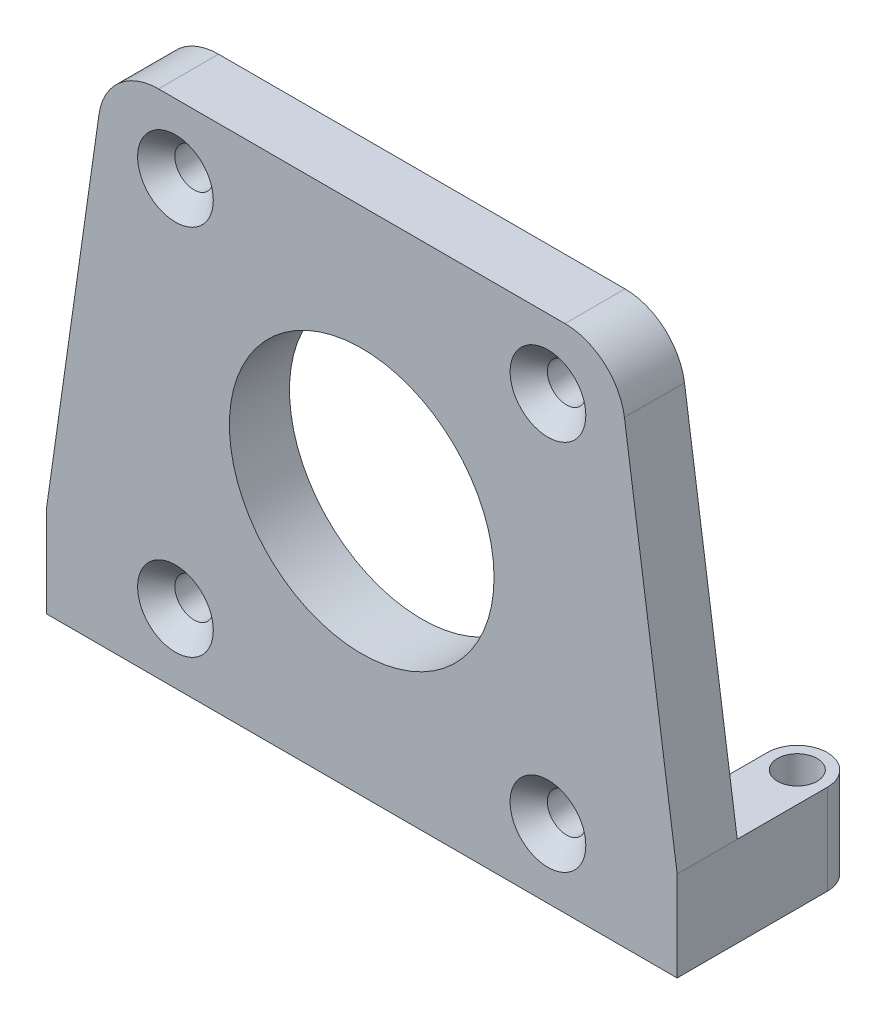
ISO-10303-21;
HEADER;
FILE_DESCRIPTION(('STEP AP214'),'2;1');
FILE_NAME('part.step','',(''),(''),'','','');
FILE_SCHEMA(('AUTOMOTIVE_DESIGN { 1 0 10303 214 1 1 1 1 }'));
ENDSEC;
DATA;
#1=APPLICATION_CONTEXT('core data for automotive mechanical design processes');
#2=APPLICATION_PROTOCOL_DEFINITION('international standard','automotive_design',2000,#1);
#3=PRODUCT_CONTEXT('',#1,'mechanical');
#4=PRODUCT('Part','Part','',(#3));
#5=PRODUCT_RELATED_PRODUCT_CATEGORY('part','',(#4));
#6=PRODUCT_DEFINITION_FORMATION('','',#4);
#7=PRODUCT_DEFINITION_CONTEXT('part definition',#1,'design');
#8=PRODUCT_DEFINITION('design','',#6,#7);
#9=PRODUCT_DEFINITION_SHAPE('','',#8);
#10=(LENGTH_UNIT() NAMED_UNIT(*) SI_UNIT(.MILLI.,.METRE.));
#11=(NAMED_UNIT(*) PLANE_ANGLE_UNIT() SI_UNIT($,.RADIAN.));
#12=(NAMED_UNIT(*) SI_UNIT($,.STERADIAN.) SOLID_ANGLE_UNIT());
#13=UNCERTAINTY_MEASURE_WITH_UNIT(LENGTH_MEASURE(1.E-05),#10,'distance_accuracy_value','');
#14=(GEOMETRIC_REPRESENTATION_CONTEXT(3) GLOBAL_UNCERTAINTY_ASSIGNED_CONTEXT((#13)) GLOBAL_UNIT_ASSIGNED_CONTEXT((#10,
#11,#12)) REPRESENTATION_CONTEXT('',''));
#15=CARTESIAN_POINT('',(0.,0.,0.));
#16=DIRECTION('',(0.,0.,1.));
#17=DIRECTION('',(1.,0.,0.));
#18=AXIS2_PLACEMENT_3D('',#15,#16,#17);
#19=CARTESIAN_POINT('',(9.33647700847534,37.5,0.));
#20=DIRECTION('',(0.,0.,-1.));
#21=DIRECTION('',(-1.,0.,0.));
#22=AXIS2_PLACEMENT_3D('',#19,#20,#21);
#23=PLANE('',#22);
#24=CARTESIAN_POINT('',(10.75,36.75,0.));
#25=DIRECTION('',(0.,0.,-1.));
#26=DIRECTION('',(-1.,0.,0.));
#27=AXIS2_PLACEMENT_3D('',#24,#25,#26);
#28=CIRCLE('',#27,1.6);
#29=CARTESIAN_POINT('',(9.15,36.75,0.));
#30=VERTEX_POINT('',#29);
#31=EDGE_CURVE('E43',#30,#30,#28,.T.);
#32=ORIENTED_EDGE('',*,*,#31,.F.);
#33=EDGE_LOOP('',(#32));
#34=FACE_BOUND('',#33,.T.);
#35=CARTESIAN_POINT('',(41.75,5.75,0.));
#36=DIRECTION('',(0.,0.,-1.));
#37=DIRECTION('',(-1.,0.,0.));
#38=AXIS2_PLACEMENT_3D('',#35,#36,#37);
#39=CIRCLE('',#38,1.6);
#40=CARTESIAN_POINT('',(40.15,5.75,0.));
#41=VERTEX_POINT('',#40);
#42=EDGE_CURVE('E175',#41,#41,#39,.T.);
#43=ORIENTED_EDGE('',*,*,#42,.F.);
#44=EDGE_LOOP('',(#43));
#45=FACE_BOUND('',#44,.T.);
#46=CARTESIAN_POINT('',(10.75,5.75,0.));
#47=DIRECTION('',(0.,0.,-1.));
#48=DIRECTION('',(-1.,0.,0.));
#49=AXIS2_PLACEMENT_3D('',#46,#47,#48);
#50=CIRCLE('',#49,1.6);
#51=CARTESIAN_POINT('',(9.15,5.75,0.));
#52=VERTEX_POINT('',#51);
#53=EDGE_CURVE('E182',#52,#52,#50,.T.);
#54=ORIENTED_EDGE('',*,*,#53,.F.);
#55=EDGE_LOOP('',(#54));
#56=FACE_BOUND('',#55,.T.);
#57=CARTESIAN_POINT('',(41.75,36.75,0.));
#58=DIRECTION('',(0.,0.,-1.));
#59=DIRECTION('',(-1.,0.,0.));
#60=AXIS2_PLACEMENT_3D('',#57,#58,#59);
#61=CIRCLE('',#60,1.6);
#62=CARTESIAN_POINT('',(40.15,36.75,0.));
#63=VERTEX_POINT('',#62);
#64=EDGE_CURVE('E189',#63,#63,#61,.T.);
#65=ORIENTED_EDGE('',*,*,#64,.F.);
#66=EDGE_LOOP('',(#65));
#67=FACE_BOUND('',#66,.T.);
#68=DIRECTION('',(0.,-1.,0.));
#69=VECTOR('',#68,1.);
#70=CARTESIAN_POINT('',(5.,7.5,0.));
#71=LINE('',#70,#69);
#72=CARTESIAN_POINT('',(5.,7.5,0.));
#73=VERTEX_POINT('',#72);
#74=CARTESIAN_POINT('',(5.,0.,0.));
#75=VERTEX_POINT('',#74);
#76=EDGE_CURVE('E205',#73,#75,#71,.T.);
#77=ORIENTED_EDGE('',*,*,#76,.F.);
#78=DIRECTION('',(-1.,0.,0.));
#79=VECTOR('',#78,1.);
#80=CARTESIAN_POINT('',(0.,7.5,0.));
#81=LINE('',#80,#79);
#82=CARTESIAN_POINT('',(0.,7.5,0.));
#83=VERTEX_POINT('',#82);
#84=EDGE_CURVE('E198',#73,#83,#81,.T.);
#85=ORIENTED_EDGE('',*,*,#84,.T.);
#86=DIRECTION('',(-0.141421356237309,-0.989949493661166,0.));
#87=VECTOR('',#86,1.);
#88=CARTESIAN_POINT('',(0.,7.5,0.));
#89=LINE('',#88,#87);
#90=CARTESIAN_POINT('',(4.38672954016951,38.2071067811865,0.));
#91=VERTEX_POINT('',#90);
#92=EDGE_CURVE('E260',#91,#83,#89,.T.);
#93=ORIENTED_EDGE('',*,*,#92,.F.);
#94=CARTESIAN_POINT('',(9.33647700847534,37.5,0.));
#95=DIRECTION('',(0.,0.,1.));
#96=DIRECTION('',(-1.,0.,0.));
#97=AXIS2_PLACEMENT_3D('',#94,#95,#96);
#98=CIRCLE('',#97,5.);
#99=CARTESIAN_POINT('',(9.33647700847537,42.5,0.));
#100=VERTEX_POINT('',#99);
#101=EDGE_CURVE('E258',#100,#91,#98,.T.);
#102=ORIENTED_EDGE('',*,*,#101,.F.);
#103=DIRECTION('',(-1.,0.,0.));
#104=VECTOR('',#103,1.);
#105=CARTESIAN_POINT('',(9.33647700847537,42.5,0.));
#106=LINE('',#105,#104);
#107=CARTESIAN_POINT('',(43.1635229915246,42.5,0.));
#108=VERTEX_POINT('',#107);
#109=EDGE_CURVE('E256',#108,#100,#106,.T.);
#110=ORIENTED_EDGE('',*,*,#109,.F.);
#111=CARTESIAN_POINT('',(43.1635229915247,37.5,0.));
#112=DIRECTION('',(0.,0.,1.));
#113=DIRECTION('',(1.,0.,0.));
#114=AXIS2_PLACEMENT_3D('',#111,#112,#113);
#115=CIRCLE('',#114,5.);
#116=CARTESIAN_POINT('',(48.1132704598305,38.2071067811865,0.));
#117=VERTEX_POINT('',#116);
#118=EDGE_CURVE('E254',#117,#108,#115,.T.);
#119=ORIENTED_EDGE('',*,*,#118,.F.);
#120=DIRECTION('',(-0.141421356237309,0.989949493661166,0.));
#121=VECTOR('',#120,1.);
#122=CARTESIAN_POINT('',(52.5,7.5,0.));
#123=LINE('',#122,#121);
#124=CARTESIAN_POINT('',(52.5,7.5,0.));
#125=VERTEX_POINT('',#124);
#126=EDGE_CURVE('E246',#125,#117,#123,.T.);
#127=ORIENTED_EDGE('',*,*,#126,.F.);
#128=DIRECTION('',(-1.,0.,0.));
#129=VECTOR('',#128,1.);
#130=CARTESIAN_POINT('',(52.5,7.5,0.));
#131=LINE('',#130,#129);
#132=CARTESIAN_POINT('',(47.5,7.5,0.));
#133=VERTEX_POINT('',#132);
#134=EDGE_CURVE('E215',#125,#133,#131,.T.);
#135=ORIENTED_EDGE('',*,*,#134,.T.);
#136=DIRECTION('',(0.,-1.,0.));
#137=VECTOR('',#136,1.);
#138=CARTESIAN_POINT('',(47.5,7.5,0.));
#139=LINE('',#138,#137);
#140=CARTESIAN_POINT('',(47.5,0.,0.));
#141=VERTEX_POINT('',#140);
#142=EDGE_CURVE('E225',#133,#141,#139,.T.);
#143=ORIENTED_EDGE('',*,*,#142,.T.);
#144=DIRECTION('',(1.,0.,0.));
#145=VECTOR('',#144,1.);
#146=CARTESIAN_POINT('',(0.,0.,0.));
#147=LINE('',#146,#145);
#148=EDGE_CURVE('E61',#75,#141,#147,.T.);
#149=ORIENTED_EDGE('',*,*,#148,.F.);
#150=EDGE_LOOP('',(#77,#85,#93,#102,#110,#119,#127,#135,#143,#149));
#151=FACE_BOUND('',#150,.T.);
#152=CARTESIAN_POINT('',(26.25,21.25,0.));
#153=DIRECTION('',(0.,0.,1.));
#154=DIRECTION('',(1.,0.,0.));
#155=AXIS2_PLACEMENT_3D('',#152,#153,#154);
#156=CIRCLE('',#155,11.0125);
#157=CARTESIAN_POINT('',(37.2625,21.25,0.));
#158=VERTEX_POINT('',#157);
#159=EDGE_CURVE('E231',#158,#158,#156,.T.);
#160=ORIENTED_EDGE('',*,*,#159,.T.);
#161=EDGE_LOOP('',(#160));
#162=FACE_BOUND('',#161,.T.);
#163=ADVANCED_FACE('F39',(#34,#45,#56,#67,#151,#162),#23,.T.);
#164=CARTESIAN_POINT('',(9.33647700847534,37.5,5.));
#165=DIRECTION('',(0.,0.,-1.));
#166=DIRECTION('',(-1.,0.,0.));
#167=AXIS2_PLACEMENT_3D('',#164,#165,#166);
#168=PLANE('',#167);
#169=CARTESIAN_POINT('',(10.75,36.75,5.));
#170=DIRECTION('',(0.,0.,1.));
#171=DIRECTION('',(1.,0.,0.));
#172=AXIS2_PLACEMENT_3D('',#169,#170,#171);
#173=CIRCLE('',#172,3.15);
#174=CARTESIAN_POINT('',(13.9,36.75,5.));
#175=VERTEX_POINT('',#174);
#176=EDGE_CURVE('E163',#175,#175,#173,.T.);
#177=ORIENTED_EDGE('',*,*,#176,.F.);
#178=EDGE_LOOP('',(#177));
#179=FACE_BOUND('',#178,.T.);
#180=CARTESIAN_POINT('',(41.75,5.75,5.));
#181=DIRECTION('',(0.,0.,1.));
#182=DIRECTION('',(1.,0.,0.));
#183=AXIS2_PLACEMENT_3D('',#180,#181,#182);
#184=CIRCLE('',#183,3.15);
#185=CARTESIAN_POINT('',(44.9,5.75,5.));
#186=VERTEX_POINT('',#185);
#187=EDGE_CURVE('E169',#186,#186,#184,.T.);
#188=ORIENTED_EDGE('',*,*,#187,.F.);
#189=EDGE_LOOP('',(#188));
#190=FACE_BOUND('',#189,.T.);
#191=CARTESIAN_POINT('',(10.75,5.75,5.));
#192=DIRECTION('',(0.,0.,1.));
#193=DIRECTION('',(1.,0.,0.));
#194=AXIS2_PLACEMENT_3D('',#191,#192,#193);
#195=CIRCLE('',#194,3.15);
#196=CARTESIAN_POINT('',(13.9,5.75,5.));
#197=VERTEX_POINT('',#196);
#198=EDGE_CURVE('E176',#197,#197,#195,.T.);
#199=ORIENTED_EDGE('',*,*,#198,.F.);
#200=EDGE_LOOP('',(#199));
#201=FACE_BOUND('',#200,.T.);
#202=CARTESIAN_POINT('',(41.75,36.75,5.));
#203=DIRECTION('',(0.,0.,1.));
#204=DIRECTION('',(1.,0.,0.));
#205=AXIS2_PLACEMENT_3D('',#202,#203,#204);
#206=CIRCLE('',#205,3.15);
#207=CARTESIAN_POINT('',(44.9,36.75,5.));
#208=VERTEX_POINT('',#207);
#209=EDGE_CURVE('E183',#208,#208,#206,.T.);
#210=ORIENTED_EDGE('',*,*,#209,.F.);
#211=EDGE_LOOP('',(#210));
#212=FACE_BOUND('',#211,.T.);
#213=DIRECTION('',(0.,-1.,0.));
#214=VECTOR('',#213,1.);
#215=CARTESIAN_POINT('',(0.,0.,5.));
#216=LINE('',#215,#214);
#217=CARTESIAN_POINT('',(0.,7.5,5.));
#218=VERTEX_POINT('',#217);
#219=CARTESIAN_POINT('',(0.,0.,5.));
#220=VERTEX_POINT('',#219);
#221=EDGE_CURVE('E263',#218,#220,#216,.T.);
#222=ORIENTED_EDGE('',*,*,#221,.T.);
#223=DIRECTION('',(1.,0.,0.));
#224=VECTOR('',#223,1.);
#225=CARTESIAN_POINT('',(0.,0.,5.));
#226=LINE('',#225,#224);
#227=CARTESIAN_POINT('',(52.5,0.,5.));
#228=VERTEX_POINT('',#227);
#229=EDGE_CURVE('E335',#220,#228,#226,.T.);
#230=ORIENTED_EDGE('',*,*,#229,.T.);
#231=DIRECTION('',(0.,1.,0.));
#232=VECTOR('',#231,1.);
#233=CARTESIAN_POINT('',(52.5,0.,5.));
#234=LINE('',#233,#232);
#235=CARTESIAN_POINT('',(52.5,7.5,5.));
#236=VERTEX_POINT('',#235);
#237=EDGE_CURVE('E319',#228,#236,#234,.T.);
#238=ORIENTED_EDGE('',*,*,#237,.T.);
#239=DIRECTION('',(-0.141421356237309,0.989949493661166,0.));
#240=VECTOR('',#239,1.);
#241=CARTESIAN_POINT('',(52.5,7.5,5.));
#242=LINE('',#241,#240);
#243=CARTESIAN_POINT('',(48.1132704598305,38.2071067811865,5.));
#244=VERTEX_POINT('',#243);
#245=EDGE_CURVE('E315',#236,#244,#242,.T.);
#246=ORIENTED_EDGE('',*,*,#245,.T.);
#247=CARTESIAN_POINT('',(43.1635229915247,37.5,5.));
#248=DIRECTION('',(0.,0.,1.));
#249=DIRECTION('',(1.,0.,0.));
#250=AXIS2_PLACEMENT_3D('',#247,#248,#249);
#251=CIRCLE('',#250,5.);
#252=CARTESIAN_POINT('',(43.1635229915246,42.5,5.));
#253=VERTEX_POINT('',#252);
#254=EDGE_CURVE('E311',#244,#253,#251,.T.);
#255=ORIENTED_EDGE('',*,*,#254,.T.);
#256=DIRECTION('',(-1.,0.,0.));
#257=VECTOR('',#256,1.);
#258=CARTESIAN_POINT('',(9.33647700847537,42.5,5.));
#259=LINE('',#258,#257);
#260=CARTESIAN_POINT('',(9.33647700847537,42.5,5.));
#261=VERTEX_POINT('',#260);
#262=EDGE_CURVE('E314',#253,#261,#259,.T.);
#263=ORIENTED_EDGE('',*,*,#262,.T.);
#264=CARTESIAN_POINT('',(9.33647700847534,37.5,5.));
#265=DIRECTION('',(0.,0.,1.));
#266=DIRECTION('',(-1.,0.,0.));
#267=AXIS2_PLACEMENT_3D('',#264,#265,#266);
#268=CIRCLE('',#267,5.);
#269=CARTESIAN_POINT('',(4.38672954016951,38.2071067811865,5.));
#270=VERTEX_POINT('',#269);
#271=EDGE_CURVE('E317',#261,#270,#268,.T.);
#272=ORIENTED_EDGE('',*,*,#271,.T.);
#273=DIRECTION('',(-0.141421356237309,-0.989949493661166,0.));
#274=VECTOR('',#273,1.);
#275=CARTESIAN_POINT('',(0.,7.5,5.));
#276=LINE('',#275,#274);
#277=EDGE_CURVE('E251',#270,#218,#276,.T.);
#278=ORIENTED_EDGE('',*,*,#277,.T.);
#279=EDGE_LOOP('',(#222,#230,#238,#246,#255,#263,#272,#278));
#280=FACE_BOUND('',#279,.T.);
#281=CARTESIAN_POINT('',(26.25,21.25,5.));
#282=DIRECTION('',(0.,0.,1.));
#283=DIRECTION('',(1.,0.,0.));
#284=AXIS2_PLACEMENT_3D('',#281,#282,#283);
#285=CIRCLE('',#284,11.0125);
#286=CARTESIAN_POINT('',(37.2625,21.25,5.));
#287=VERTEX_POINT('',#286);
#288=EDGE_CURVE('E236',#287,#287,#285,.T.);
#289=ORIENTED_EDGE('',*,*,#288,.F.);
#290=EDGE_LOOP('',(#289));
#291=FACE_BOUND('',#290,.T.);
#292=ADVANCED_FACE('F327',(#179,#190,#201,#212,#280,#291),#168,.F.);
#293=CARTESIAN_POINT('',(0.,0.,5.));
#294=DIRECTION('',(1.,0.,0.));
#295=DIRECTION('',(0.,0.,-1.));
#296=AXIS2_PLACEMENT_3D('',#293,#294,#295);
#297=PLANE('',#296);
#298=DIRECTION('',(0.,0.,-1.));
#299=VECTOR('',#298,1.);
#300=CARTESIAN_POINT('',(0.,7.5,5.));
#301=LINE('',#300,#299);
#302=EDGE_CURVE('E264',#218,#83,#301,.T.);
#303=ORIENTED_EDGE('',*,*,#302,.T.);
#304=DIRECTION('',(0.,0.,-1.));
#305=VECTOR('',#304,1.);
#306=CARTESIAN_POINT('',(0.,7.5,0.));
#307=LINE('',#306,#305);
#308=CARTESIAN_POINT('',(0.,7.5,-7.5));
#309=VERTEX_POINT('',#308);
#310=EDGE_CURVE('E190',#83,#309,#307,.T.);
#311=ORIENTED_EDGE('',*,*,#310,.T.);
#312=DIRECTION('',(0.,-1.,0.));
#313=VECTOR('',#312,1.);
#314=CARTESIAN_POINT('',(0.,7.5,-7.5));
#315=LINE('',#314,#313);
#316=CARTESIAN_POINT('',(0.,0.,-7.5));
#317=VERTEX_POINT('',#316);
#318=EDGE_CURVE('E201',#309,#317,#315,.T.);
#319=ORIENTED_EDGE('',*,*,#318,.T.);
#320=DIRECTION('',(0.,0.,-1.));
#321=VECTOR('',#320,1.);
#322=CARTESIAN_POINT('',(0.,0.,5.));
#323=LINE('',#322,#321);
#324=EDGE_CURVE('E11',#220,#317,#323,.T.);
#325=ORIENTED_EDGE('',*,*,#324,.F.);
#326=ORIENTED_EDGE('',*,*,#221,.F.);
#327=EDGE_LOOP('',(#303,#311,#319,#325,#326));
#328=FACE_BOUND('',#327,.T.);
#329=ADVANCED_FACE('F41',(#328),#297,.F.);
#330=CARTESIAN_POINT('',(0.,0.,5.));
#331=DIRECTION('',(0.,1.,0.));
#332=DIRECTION('',(0.,0.,1.));
#333=AXIS2_PLACEMENT_3D('',#330,#331,#332);
#334=PLANE('',#333);
#335=CARTESIAN_POINT('',(2.5,0.,-7.5));
#336=DIRECTION('',(0.,-1.,0.));
#337=DIRECTION('',(0.,0.,-1.));
#338=AXIS2_PLACEMENT_3D('',#335,#336,#337);
#339=CIRCLE('',#338,1.64999999999999);
#340=CARTESIAN_POINT('',(2.5,0.,-9.14999999999999));
#341=VERTEX_POINT('',#340);
#342=EDGE_CURVE('E399',#341,#341,#339,.T.);
#343=ORIENTED_EDGE('',*,*,#342,.F.);
#344=EDGE_LOOP('',(#343));
#345=FACE_BOUND('',#344,.T.);
#346=CARTESIAN_POINT('',(50.,0.,-7.5));
#347=DIRECTION('',(0.,-1.,0.));
#348=DIRECTION('',(0.,0.,-1.));
#349=AXIS2_PLACEMENT_3D('',#346,#347,#348);
#350=CIRCLE('',#349,1.64999999999999);
#351=CARTESIAN_POINT('',(50.,0.,-9.15));
#352=VERTEX_POINT('',#351);
#353=EDGE_CURVE('E403',#352,#352,#350,.T.);
#354=ORIENTED_EDGE('',*,*,#353,.F.);
#355=EDGE_LOOP('',(#354));
#356=FACE_BOUND('',#355,.T.);
#357=CARTESIAN_POINT('',(50.,0.,2.5));
#358=DIRECTION('',(0.,-1.,0.));
#359=DIRECTION('',(0.,0.,-1.));
#360=AXIS2_PLACEMENT_3D('',#357,#358,#359);
#361=CIRCLE('',#360,1.64999999999999);
#362=CARTESIAN_POINT('',(50.,0.,0.850000000000008));
#363=VERTEX_POINT('',#362);
#364=EDGE_CURVE('E151',#363,#363,#361,.T.);
#365=ORIENTED_EDGE('',*,*,#364,.F.);
#366=EDGE_LOOP('',(#365));
#367=FACE_BOUND('',#366,.T.);
#368=CARTESIAN_POINT('',(2.5,0.,2.5));
#369=DIRECTION('',(0.,-1.,0.));
#370=DIRECTION('',(0.,0.,-1.));
#371=AXIS2_PLACEMENT_3D('',#368,#369,#370);
#372=CIRCLE('',#371,1.64999999999999);
#373=CARTESIAN_POINT('',(2.5,0.,0.850000000000011));
#374=VERTEX_POINT('',#373);
#375=EDGE_CURVE('E150',#374,#374,#372,.T.);
#376=ORIENTED_EDGE('',*,*,#375,.F.);
#377=EDGE_LOOP('',(#376));
#378=FACE_BOUND('',#377,.T.);
#379=ORIENTED_EDGE('',*,*,#324,.T.);
#380=CARTESIAN_POINT('',(2.5,0.,-7.5));
#381=DIRECTION('',(0.,-1.,0.));
#382=DIRECTION('',(0.,0.,-1.));
#383=AXIS2_PLACEMENT_3D('',#380,#381,#382);
#384=CIRCLE('',#383,2.5);
#385=CARTESIAN_POINT('',(5.,0.,-7.5));
#386=VERTEX_POINT('',#385);
#387=EDGE_CURVE('E202',#317,#386,#384,.T.);
#388=ORIENTED_EDGE('',*,*,#387,.T.);
#389=DIRECTION('',(0.,0.,1.));
#390=VECTOR('',#389,1.);
#391=CARTESIAN_POINT('',(5.,0.,0.));
#392=LINE('',#391,#390);
#393=EDGE_CURVE('E56',#386,#75,#392,.T.);
#394=ORIENTED_EDGE('',*,*,#393,.T.);
#395=ORIENTED_EDGE('',*,*,#148,.T.);
#396=DIRECTION('',(0.,0.,-1.));
#397=VECTOR('',#396,1.);
#398=CARTESIAN_POINT('',(47.5,0.,0.));
#399=LINE('',#398,#397);
#400=CARTESIAN_POINT('',(47.5,0.,-7.5));
#401=VERTEX_POINT('',#400);
#402=EDGE_CURVE('E207',#141,#401,#399,.T.);
#403=ORIENTED_EDGE('',*,*,#402,.T.);
#404=CARTESIAN_POINT('',(50.,0.,-7.5));
#405=DIRECTION('',(0.,-1.,0.));
#406=DIRECTION('',(0.,0.,-1.));
#407=AXIS2_PLACEMENT_3D('',#404,#405,#406);
#408=CIRCLE('',#407,2.5);
#409=CARTESIAN_POINT('',(52.5,0.,-7.5));
#410=VERTEX_POINT('',#409);
#411=EDGE_CURVE('E216',#401,#410,#408,.T.);
#412=ORIENTED_EDGE('',*,*,#411,.T.);
#413=DIRECTION('',(0.,0.,-1.));
#414=VECTOR('',#413,1.);
#415=CARTESIAN_POINT('',(52.5,0.,5.));
#416=LINE('',#415,#414);
#417=EDGE_CURVE('E48',#228,#410,#416,.T.);
#418=ORIENTED_EDGE('',*,*,#417,.F.);
#419=ORIENTED_EDGE('',*,*,#229,.F.);
#420=EDGE_LOOP('',(#379,#388,#394,#395,#403,#412,#418,#419));
#421=FACE_BOUND('',#420,.T.);
#422=ADVANCED_FACE('F283',(#345,#356,#367,#378,#421),#334,.F.);
#423=CARTESIAN_POINT('',(52.5,0.,5.));
#424=DIRECTION('',(-1.,0.,0.));
#425=DIRECTION('',(0.,0.,1.));
#426=AXIS2_PLACEMENT_3D('',#423,#424,#425);
#427=PLANE('',#426);
#428=ORIENTED_EDGE('',*,*,#417,.T.);
#429=DIRECTION('',(0.,-1.,0.));
#430=VECTOR('',#429,1.);
#431=CARTESIAN_POINT('',(52.5,7.5,-7.5));
#432=LINE('',#431,#430);
#433=CARTESIAN_POINT('',(52.5,7.5,-7.5));
#434=VERTEX_POINT('',#433);
#435=EDGE_CURVE('E228',#434,#410,#432,.T.);
#436=ORIENTED_EDGE('',*,*,#435,.F.);
#437=DIRECTION('',(0.,0.,1.));
#438=VECTOR('',#437,1.);
#439=CARTESIAN_POINT('',(52.5,7.5,0.));
#440=LINE('',#439,#438);
#441=EDGE_CURVE('E212',#434,#125,#440,.T.);
#442=ORIENTED_EDGE('',*,*,#441,.T.);
#443=DIRECTION('',(0.,0.,-1.));
#444=VECTOR('',#443,1.);
#445=CARTESIAN_POINT('',(52.5,7.5,5.));
#446=LINE('',#445,#444);
#447=EDGE_CURVE('E279',#236,#125,#446,.T.);
#448=ORIENTED_EDGE('',*,*,#447,.F.);
#449=ORIENTED_EDGE('',*,*,#237,.F.);
#450=EDGE_LOOP('',(#428,#436,#442,#448,#449));
#451=FACE_BOUND('',#450,.T.);
#452=ADVANCED_FACE('F291',(#451),#427,.F.);
#453=CARTESIAN_POINT('',(52.5,7.5,5.));
#454=DIRECTION('',(-0.989949493661166,-0.141421356237309,0.));
#455=DIRECTION('',(0.141421356237309,-0.989949493661167,0.));
#456=AXIS2_PLACEMENT_3D('',#453,#454,#455);
#457=PLANE('',#456);
#458=ORIENTED_EDGE('',*,*,#126,.T.);
#459=DIRECTION('',(0.,0.,-1.));
#460=VECTOR('',#459,1.);
#461=CARTESIAN_POINT('',(48.1132704598305,38.2071067811865,5.));
#462=LINE('',#461,#460);
#463=EDGE_CURVE('E276',#244,#117,#462,.T.);
#464=ORIENTED_EDGE('',*,*,#463,.F.);
#465=ORIENTED_EDGE('',*,*,#245,.F.);
#466=ORIENTED_EDGE('',*,*,#447,.T.);
#467=EDGE_LOOP('',(#458,#464,#465,#466));
#468=FACE_BOUND('',#467,.T.);
#469=ADVANCED_FACE('F305',(#468),#457,.F.);
#470=CARTESIAN_POINT('',(43.1635229915247,37.5,5.));
#471=DIRECTION('',(0.,0.,-1.));
#472=DIRECTION('',(-1.,0.,0.));
#473=AXIS2_PLACEMENT_3D('',#470,#471,#472);
#474=CYLINDRICAL_SURFACE('',#473,5.);
#475=ORIENTED_EDGE('',*,*,#118,.T.);
#476=DIRECTION('',(0.,0.,-1.));
#477=VECTOR('',#476,1.);
#478=CARTESIAN_POINT('',(43.1635229915246,42.5,5.));
#479=LINE('',#478,#477);
#480=EDGE_CURVE('E273',#253,#108,#479,.T.);
#481=ORIENTED_EDGE('',*,*,#480,.F.);
#482=ORIENTED_EDGE('',*,*,#254,.F.);
#483=ORIENTED_EDGE('',*,*,#463,.T.);
#484=EDGE_LOOP('',(#475,#481,#482,#483));
#485=FACE_BOUND('',#484,.T.);
#486=ADVANCED_FACE('F309',(#485),#474,.T.);
#487=CARTESIAN_POINT('',(9.33647700847537,42.5,5.));
#488=DIRECTION('',(0.,-1.,0.));
#489=DIRECTION('',(0.,0.,-1.));
#490=AXIS2_PLACEMENT_3D('',#487,#488,#489);
#491=PLANE('',#490);
#492=ORIENTED_EDGE('',*,*,#109,.T.);
#493=DIRECTION('',(0.,0.,-1.));
#494=VECTOR('',#493,1.);
#495=CARTESIAN_POINT('',(9.33647700847537,42.5,5.));
#496=LINE('',#495,#494);
#497=EDGE_CURVE('E270',#261,#100,#496,.T.);
#498=ORIENTED_EDGE('',*,*,#497,.F.);
#499=ORIENTED_EDGE('',*,*,#262,.F.);
#500=ORIENTED_EDGE('',*,*,#480,.T.);
#501=EDGE_LOOP('',(#492,#498,#499,#500));
#502=FACE_BOUND('',#501,.T.);
#503=ADVANCED_FACE('F381',(#502),#491,.F.);
#504=CARTESIAN_POINT('',(9.33647700847534,37.5,5.));
#505=DIRECTION('',(0.,0.,-1.));
#506=DIRECTION('',(-1.,0.,0.));
#507=AXIS2_PLACEMENT_3D('',#504,#505,#506);
#508=CYLINDRICAL_SURFACE('',#507,5.);
#509=ORIENTED_EDGE('',*,*,#101,.T.);
#510=DIRECTION('',(0.,0.,-1.));
#511=VECTOR('',#510,1.);
#512=CARTESIAN_POINT('',(4.38672954016951,38.2071067811865,5.));
#513=LINE('',#512,#511);
#514=EDGE_CURVE('E267',#270,#91,#513,.T.);
#515=ORIENTED_EDGE('',*,*,#514,.F.);
#516=ORIENTED_EDGE('',*,*,#271,.F.);
#517=ORIENTED_EDGE('',*,*,#497,.T.);
#518=EDGE_LOOP('',(#509,#515,#516,#517));
#519=FACE_BOUND('',#518,.T.);
#520=ADVANCED_FACE('F378',(#519),#508,.T.);
#521=CARTESIAN_POINT('',(0.,7.5,5.));
#522=DIRECTION('',(0.989949493661166,-0.141421356237309,0.));
#523=DIRECTION('',(0.14142135623731,0.989949493661167,0.));
#524=AXIS2_PLACEMENT_3D('',#521,#522,#523);
#525=PLANE('',#524);
#526=ORIENTED_EDGE('',*,*,#92,.T.);
#527=ORIENTED_EDGE('',*,*,#302,.F.);
#528=ORIENTED_EDGE('',*,*,#277,.F.);
#529=ORIENTED_EDGE('',*,*,#514,.T.);
#530=EDGE_LOOP('',(#526,#527,#528,#529));
#531=FACE_BOUND('',#530,.T.);
#532=ADVANCED_FACE('F332',(#531),#525,.F.);
#533=CARTESIAN_POINT('',(26.25,21.25,5.));
#534=DIRECTION('',(0.,0.,-1.));
#535=DIRECTION('',(-1.,0.,0.));
#536=AXIS2_PLACEMENT_3D('',#533,#534,#535);
#537=CYLINDRICAL_SURFACE('',#536,11.0125);
#538=ORIENTED_EDGE('',*,*,#288,.T.);
#539=EDGE_LOOP('',(#538));
#540=FACE_BOUND('',#539,.T.);
#541=ORIENTED_EDGE('',*,*,#159,.F.);
#542=EDGE_LOOP('',(#541));
#543=FACE_BOUND('',#542,.T.);
#544=ADVANCED_FACE('F377',(#540,#543),#537,.F.);
#545=CARTESIAN_POINT('',(50.,7.5,-7.5));
#546=DIRECTION('',(0.,-1.,0.));
#547=DIRECTION('',(0.,0.,-1.));
#548=AXIS2_PLACEMENT_3D('',#545,#546,#547);
#549=CYLINDRICAL_SURFACE('',#548,2.5);
#550=ORIENTED_EDGE('',*,*,#411,.F.);
#551=DIRECTION('',(0.,-1.,0.));
#552=VECTOR('',#551,1.);
#553=CARTESIAN_POINT('',(47.5,7.5,-7.5));
#554=LINE('',#553,#552);
#555=CARTESIAN_POINT('',(47.5,7.5,-7.5));
#556=VERTEX_POINT('',#555);
#557=EDGE_CURVE('E232',#556,#401,#554,.T.);
#558=ORIENTED_EDGE('',*,*,#557,.F.);
#559=CARTESIAN_POINT('',(50.,7.5,-7.5));
#560=DIRECTION('',(0.,-1.,0.));
#561=DIRECTION('',(0.,0.,-1.));
#562=AXIS2_PLACEMENT_3D('',#559,#560,#561);
#563=CIRCLE('',#562,2.5);
#564=EDGE_CURVE('E222',#556,#434,#563,.T.);
#565=ORIENTED_EDGE('',*,*,#564,.T.);
#566=ORIENTED_EDGE('',*,*,#435,.T.);
#567=EDGE_LOOP('',(#550,#558,#565,#566));
#568=FACE_BOUND('',#567,.T.);
#569=ADVANCED_FACE('F287',(#568),#549,.T.);
#570=CARTESIAN_POINT('',(47.5,7.5,0.));
#571=DIRECTION('',(-1.,0.,0.));
#572=DIRECTION('',(0.,0.,1.));
#573=AXIS2_PLACEMENT_3D('',#570,#571,#572);
#574=PLANE('',#573);
#575=ORIENTED_EDGE('',*,*,#402,.F.);
#576=ORIENTED_EDGE('',*,*,#142,.F.);
#577=DIRECTION('',(0.,0.,-1.));
#578=VECTOR('',#577,1.);
#579=CARTESIAN_POINT('',(47.5,7.5,0.));
#580=LINE('',#579,#578);
#581=EDGE_CURVE('E219',#133,#556,#580,.T.);
#582=ORIENTED_EDGE('',*,*,#581,.T.);
#583=ORIENTED_EDGE('',*,*,#557,.T.);
#584=EDGE_LOOP('',(#575,#576,#582,#583));
#585=FACE_BOUND('',#584,.T.);
#586=ADVANCED_FACE('F550',(#585),#574,.T.);
#587=CARTESIAN_POINT('',(50.,7.5,-7.5));
#588=DIRECTION('',(0.,-1.,0.));
#589=DIRECTION('',(0.,0.,-1.));
#590=AXIS2_PLACEMENT_3D('',#587,#588,#589);
#591=PLANE('',#590);
#592=CARTESIAN_POINT('',(50.,7.5,-7.5));
#593=DIRECTION('',(0.,-1.,0.));
#594=DIRECTION('',(0.,0.,-1.));
#595=AXIS2_PLACEMENT_3D('',#592,#593,#594);
#596=CIRCLE('',#595,1.65);
#597=CARTESIAN_POINT('',(50.,7.5,-9.15));
#598=VERTEX_POINT('',#597);
#599=EDGE_CURVE('E157',#598,#598,#596,.T.);
#600=ORIENTED_EDGE('',*,*,#599,.T.);
#601=EDGE_LOOP('',(#600));
#602=FACE_BOUND('',#601,.T.);
#603=ORIENTED_EDGE('',*,*,#441,.F.);
#604=ORIENTED_EDGE('',*,*,#564,.F.);
#605=ORIENTED_EDGE('',*,*,#581,.F.);
#606=ORIENTED_EDGE('',*,*,#134,.F.);
#607=EDGE_LOOP('',(#603,#604,#605,#606));
#608=FACE_BOUND('',#607,.T.);
#609=ADVANCED_FACE('F295',(#602,#608),#591,.F.);
#610=CARTESIAN_POINT('',(5.,7.5,0.));
#611=DIRECTION('',(1.,0.,0.));
#612=DIRECTION('',(0.,0.,-1.));
#613=AXIS2_PLACEMENT_3D('',#610,#611,#612);
#614=PLANE('',#613);
#615=ORIENTED_EDGE('',*,*,#393,.F.);
#616=DIRECTION('',(0.,-1.,0.));
#617=VECTOR('',#616,1.);
#618=CARTESIAN_POINT('',(5.,7.5,-7.5));
#619=LINE('',#618,#617);
#620=CARTESIAN_POINT('',(5.,7.5,-7.5));
#621=VERTEX_POINT('',#620);
#622=EDGE_CURVE('E208',#621,#386,#619,.T.);
#623=ORIENTED_EDGE('',*,*,#622,.F.);
#624=DIRECTION('',(0.,0.,1.));
#625=VECTOR('',#624,1.);
#626=CARTESIAN_POINT('',(5.,7.5,0.));
#627=LINE('',#626,#625);
#628=EDGE_CURVE('E196',#621,#73,#627,.T.);
#629=ORIENTED_EDGE('',*,*,#628,.T.);
#630=ORIENTED_EDGE('',*,*,#76,.T.);
#631=EDGE_LOOP('',(#615,#623,#629,#630));
#632=FACE_BOUND('',#631,.T.);
#633=ADVANCED_FACE('F344',(#632),#614,.T.);
#634=CARTESIAN_POINT('',(2.5,7.5,-7.5));
#635=DIRECTION('',(0.,-1.,0.));
#636=DIRECTION('',(0.,0.,-1.));
#637=AXIS2_PLACEMENT_3D('',#634,#635,#636);
#638=CYLINDRICAL_SURFACE('',#637,2.5);
#639=ORIENTED_EDGE('',*,*,#387,.F.);
#640=ORIENTED_EDGE('',*,*,#318,.F.);
#641=CARTESIAN_POINT('',(2.5,7.5,-7.5));
#642=DIRECTION('',(0.,-1.,0.));
#643=DIRECTION('',(0.,0.,-1.));
#644=AXIS2_PLACEMENT_3D('',#641,#642,#643);
#645=CIRCLE('',#644,2.5);
#646=EDGE_CURVE('E193',#309,#621,#645,.T.);
#647=ORIENTED_EDGE('',*,*,#646,.T.);
#648=ORIENTED_EDGE('',*,*,#622,.T.);
#649=EDGE_LOOP('',(#639,#640,#647,#648));
#650=FACE_BOUND('',#649,.T.);
#651=ADVANCED_FACE('F341',(#650),#638,.T.);
#652=CARTESIAN_POINT('',(2.5,7.5,-7.5));
#653=DIRECTION('',(0.,-1.,0.));
#654=DIRECTION('',(0.,0.,-1.));
#655=AXIS2_PLACEMENT_3D('',#652,#653,#654);
#656=PLANE('',#655);
#657=CARTESIAN_POINT('',(2.5,7.5,-7.5));
#658=DIRECTION('',(0.,-1.,0.));
#659=DIRECTION('',(0.,0.,-1.));
#660=AXIS2_PLACEMENT_3D('',#657,#658,#659);
#661=CIRCLE('',#660,1.64999999999999);
#662=CARTESIAN_POINT('',(2.5,7.5,-9.15));
#663=VERTEX_POINT('',#662);
#664=EDGE_CURVE('E541',#663,#663,#661,.T.);
#665=ORIENTED_EDGE('',*,*,#664,.T.);
#666=EDGE_LOOP('',(#665));
#667=FACE_BOUND('',#666,.T.);
#668=ORIENTED_EDGE('',*,*,#310,.F.);
#669=ORIENTED_EDGE('',*,*,#84,.F.);
#670=ORIENTED_EDGE('',*,*,#628,.F.);
#671=ORIENTED_EDGE('',*,*,#646,.F.);
#672=EDGE_LOOP('',(#668,#669,#670,#671));
#673=FACE_BOUND('',#672,.T.);
#674=ADVANCED_FACE('F348',(#667,#673),#656,.F.);
#675=CARTESIAN_POINT('',(41.75,36.75,5.));
#676=DIRECTION('',(0.,0.,1.));
#677=DIRECTION('',(1.,0.,0.));
#678=AXIS2_PLACEMENT_3D('',#675,#676,#677);
#679=CYLINDRICAL_SURFACE('',#678,1.6);
#680=ORIENTED_EDGE('',*,*,#64,.T.);
#681=EDGE_LOOP('',(#680));
#682=FACE_BOUND('',#681,.T.);
#683=CARTESIAN_POINT('',(41.75,36.75,3.45));
#684=DIRECTION('',(0.,0.,1.));
#685=DIRECTION('',(1.,0.,0.));
#686=AXIS2_PLACEMENT_3D('',#683,#684,#685);
#687=CIRCLE('',#686,1.6);
#688=CARTESIAN_POINT('',(43.35,36.75,3.45));
#689=VERTEX_POINT('',#688);
#690=EDGE_CURVE('E186',#689,#689,#687,.T.);
#691=ORIENTED_EDGE('',*,*,#690,.T.);
#692=EDGE_LOOP('',(#691));
#693=FACE_BOUND('',#692,.T.);
#694=ADVANCED_FACE('F350',(#682,#693),#679,.F.);
#695=CARTESIAN_POINT('',(41.75,36.75,5.));
#696=DIRECTION('',(0.,0.,1.));
#697=DIRECTION('',(1.,0.,0.));
#698=AXIS2_PLACEMENT_3D('',#695,#696,#697);
#699=CONICAL_SURFACE('',#698,3.15,0.785398163397449);
#700=ORIENTED_EDGE('',*,*,#690,.F.);
#701=EDGE_LOOP('',(#700));
#702=FACE_BOUND('',#701,.T.);
#703=ORIENTED_EDGE('',*,*,#209,.T.);
#704=EDGE_LOOP('',(#703));
#705=FACE_BOUND('',#704,.T.);
#706=ADVANCED_FACE('F357',(#702,#705),#699,.F.);
#707=CARTESIAN_POINT('',(10.75,5.75,5.));
#708=DIRECTION('',(0.,0.,1.));
#709=DIRECTION('',(1.,0.,0.));
#710=AXIS2_PLACEMENT_3D('',#707,#708,#709);
#711=CYLINDRICAL_SURFACE('',#710,1.6);
#712=ORIENTED_EDGE('',*,*,#53,.T.);
#713=EDGE_LOOP('',(#712));
#714=FACE_BOUND('',#713,.T.);
#715=CARTESIAN_POINT('',(10.75,5.75,3.45));
#716=DIRECTION('',(0.,0.,1.));
#717=DIRECTION('',(1.,0.,0.));
#718=AXIS2_PLACEMENT_3D('',#715,#716,#717);
#719=CIRCLE('',#718,1.6);
#720=CARTESIAN_POINT('',(12.35,5.75,3.45));
#721=VERTEX_POINT('',#720);
#722=EDGE_CURVE('E179',#721,#721,#719,.T.);
#723=ORIENTED_EDGE('',*,*,#722,.T.);
#724=EDGE_LOOP('',(#723));
#725=FACE_BOUND('',#724,.T.);
#726=ADVANCED_FACE('F439',(#714,#725),#711,.F.);
#727=CARTESIAN_POINT('',(10.75,5.75,5.));
#728=DIRECTION('',(0.,0.,1.));
#729=DIRECTION('',(1.,0.,0.));
#730=AXIS2_PLACEMENT_3D('',#727,#728,#729);
#731=CONICAL_SURFACE('',#730,3.15,0.785398163397449);
#732=ORIENTED_EDGE('',*,*,#722,.F.);
#733=EDGE_LOOP('',(#732));
#734=FACE_BOUND('',#733,.T.);
#735=ORIENTED_EDGE('',*,*,#198,.T.);
#736=EDGE_LOOP('',(#735));
#737=FACE_BOUND('',#736,.T.);
#738=ADVANCED_FACE('F435',(#734,#737),#731,.F.);
#739=CARTESIAN_POINT('',(41.75,5.75,5.));
#740=DIRECTION('',(0.,0.,1.));
#741=DIRECTION('',(1.,0.,0.));
#742=AXIS2_PLACEMENT_3D('',#739,#740,#741);
#743=CYLINDRICAL_SURFACE('',#742,1.6);
#744=ORIENTED_EDGE('',*,*,#42,.T.);
#745=EDGE_LOOP('',(#744));
#746=FACE_BOUND('',#745,.T.);
#747=CARTESIAN_POINT('',(41.75,5.75,3.45));
#748=DIRECTION('',(0.,0.,1.));
#749=DIRECTION('',(1.,0.,0.));
#750=AXIS2_PLACEMENT_3D('',#747,#748,#749);
#751=CIRCLE('',#750,1.6);
#752=CARTESIAN_POINT('',(43.35,5.75,3.45));
#753=VERTEX_POINT('',#752);
#754=EDGE_CURVE('E172',#753,#753,#751,.T.);
#755=ORIENTED_EDGE('',*,*,#754,.T.);
#756=EDGE_LOOP('',(#755));
#757=FACE_BOUND('',#756,.T.);
#758=ADVANCED_FACE('F431',(#746,#757),#743,.F.);
#759=CARTESIAN_POINT('',(41.75,5.75,5.));
#760=DIRECTION('',(0.,0.,1.));
#761=DIRECTION('',(1.,0.,0.));
#762=AXIS2_PLACEMENT_3D('',#759,#760,#761);
#763=CONICAL_SURFACE('',#762,3.15,0.785398163397449);
#764=ORIENTED_EDGE('',*,*,#754,.F.);
#765=EDGE_LOOP('',(#764));
#766=FACE_BOUND('',#765,.T.);
#767=ORIENTED_EDGE('',*,*,#187,.T.);
#768=EDGE_LOOP('',(#767));
#769=FACE_BOUND('',#768,.T.);
#770=ADVANCED_FACE('F427',(#766,#769),#763,.F.);
#771=CARTESIAN_POINT('',(10.75,36.75,5.));
#772=DIRECTION('',(0.,0.,1.));
#773=DIRECTION('',(1.,0.,0.));
#774=AXIS2_PLACEMENT_3D('',#771,#772,#773);
#775=CYLINDRICAL_SURFACE('',#774,1.6);
#776=ORIENTED_EDGE('',*,*,#31,.T.);
#777=EDGE_LOOP('',(#776));
#778=FACE_BOUND('',#777,.T.);
#779=CARTESIAN_POINT('',(10.75,36.75,3.45));
#780=DIRECTION('',(0.,0.,1.));
#781=DIRECTION('',(1.,0.,0.));
#782=AXIS2_PLACEMENT_3D('',#779,#780,#781);
#783=CIRCLE('',#782,1.6);
#784=CARTESIAN_POINT('',(12.35,36.75,3.45));
#785=VERTEX_POINT('',#784);
#786=EDGE_CURVE('E166',#785,#785,#783,.T.);
#787=ORIENTED_EDGE('',*,*,#786,.T.);
#788=EDGE_LOOP('',(#787));
#789=FACE_BOUND('',#788,.T.);
#790=ADVANCED_FACE('F423',(#778,#789),#775,.F.);
#791=CARTESIAN_POINT('',(10.75,36.75,5.));
#792=DIRECTION('',(0.,0.,1.));
#793=DIRECTION('',(1.,0.,0.));
#794=AXIS2_PLACEMENT_3D('',#791,#792,#793);
#795=CONICAL_SURFACE('',#794,3.15,0.785398163397449);
#796=ORIENTED_EDGE('',*,*,#786,.F.);
#797=EDGE_LOOP('',(#796));
#798=FACE_BOUND('',#797,.T.);
#799=ORIENTED_EDGE('',*,*,#176,.T.);
#800=EDGE_LOOP('',(#799));
#801=FACE_BOUND('',#800,.T.);
#802=ADVANCED_FACE('F415',(#798,#801),#795,.F.);
#803=CARTESIAN_POINT('',(2.5,13.,2.5));
#804=DIRECTION('',(0.,-1.,0.));
#805=DIRECTION('',(0.,0.,-1.));
#806=AXIS2_PLACEMENT_3D('',#803,#804,#805);
#807=CONICAL_SURFACE('',#806,1.65,1.02974425867665);
#808=CARTESIAN_POINT('',(2.5,13.9914200213955,2.5));
#809=VERTEX_POINT('',#808);
#810=VERTEX_LOOP('',#809);
#811=FACE_BOUND('',#810,.T.);
#812=CARTESIAN_POINT('',(2.5,13.,2.5));
#813=DIRECTION('',(0.,-1.,0.));
#814=DIRECTION('',(0.,0.,-1.));
#815=AXIS2_PLACEMENT_3D('',#812,#813,#814);
#816=CIRCLE('',#815,1.65);
#817=CARTESIAN_POINT('',(2.5,13.,0.850000000000004));
#818=VERTEX_POINT('',#817);
#819=EDGE_CURVE('E154',#818,#818,#816,.T.);
#820=ORIENTED_EDGE('',*,*,#819,.T.);
#821=EDGE_LOOP('',(#820));
#822=FACE_BOUND('',#821,.T.);
#823=ADVANCED_FACE('F409',(#811,#822),#807,.F.);
#824=CARTESIAN_POINT('',(2.5,0.,2.5));
#825=DIRECTION('',(0.,-1.,0.));
#826=DIRECTION('',(0.,0.,-1.));
#827=AXIS2_PLACEMENT_3D('',#824,#825,#826);
#828=CYLINDRICAL_SURFACE('',#827,1.64999999999999);
#829=ORIENTED_EDGE('',*,*,#819,.F.);
#830=EDGE_LOOP('',(#829));
#831=FACE_BOUND('',#830,.T.);
#832=ORIENTED_EDGE('',*,*,#375,.T.);
#833=EDGE_LOOP('',(#832));
#834=FACE_BOUND('',#833,.T.);
#835=ADVANCED_FACE('F144',(#831,#834),#828,.F.);
#836=CARTESIAN_POINT('',(50.,13.,2.5));
#837=DIRECTION('',(0.,-1.,0.));
#838=DIRECTION('',(0.,0.,-1.));
#839=AXIS2_PLACEMENT_3D('',#836,#837,#838);
#840=CONICAL_SURFACE('',#839,1.65,1.02974425867665);
#841=CARTESIAN_POINT('',(50.,13.9914200213955,2.5));
#842=VERTEX_POINT('',#841);
#843=VERTEX_LOOP('',#842);
#844=FACE_BOUND('',#843,.T.);
#845=CARTESIAN_POINT('',(50.,13.,2.5));
#846=DIRECTION('',(0.,-1.,0.));
#847=DIRECTION('',(0.,0.,-1.));
#848=AXIS2_PLACEMENT_3D('',#845,#846,#847);
#849=CIRCLE('',#848,1.65);
#850=CARTESIAN_POINT('',(50.,13.,0.850000000000001));
#851=VERTEX_POINT('',#850);
#852=EDGE_CURVE('E148',#851,#851,#849,.T.);
#853=ORIENTED_EDGE('',*,*,#852,.T.);
#854=EDGE_LOOP('',(#853));
#855=FACE_BOUND('',#854,.T.);
#856=ADVANCED_FACE('F140',(#844,#855),#840,.F.);
#857=CARTESIAN_POINT('',(50.,0.,2.5));
#858=DIRECTION('',(0.,-1.,0.));
#859=DIRECTION('',(0.,0.,-1.));
#860=AXIS2_PLACEMENT_3D('',#857,#858,#859);
#861=CYLINDRICAL_SURFACE('',#860,1.65);
#862=ORIENTED_EDGE('',*,*,#852,.F.);
#863=EDGE_LOOP('',(#862));
#864=FACE_BOUND('',#863,.T.);
#865=ORIENTED_EDGE('',*,*,#364,.T.);
#866=EDGE_LOOP('',(#865));
#867=FACE_BOUND('',#866,.T.);
#868=ADVANCED_FACE('F143',(#864,#867),#861,.F.);
#869=CARTESIAN_POINT('',(50.,0.,-7.5));
#870=DIRECTION('',(0.,-1.,0.));
#871=DIRECTION('',(0.,0.,-1.));
#872=AXIS2_PLACEMENT_3D('',#869,#870,#871);
#873=CYLINDRICAL_SURFACE('',#872,1.65);
#874=ORIENTED_EDGE('',*,*,#353,.T.);
#875=EDGE_LOOP('',(#874));
#876=FACE_BOUND('',#875,.T.);
#877=ORIENTED_EDGE('',*,*,#599,.F.);
#878=EDGE_LOOP('',(#877));
#879=FACE_BOUND('',#878,.T.);
#880=ADVANCED_FACE('F509',(#876,#879),#873,.F.);
#881=CARTESIAN_POINT('',(2.5,0.,-7.5));
#882=DIRECTION('',(0.,-1.,0.));
#883=DIRECTION('',(0.,0.,-1.));
#884=AXIS2_PLACEMENT_3D('',#881,#882,#883);
#885=CYLINDRICAL_SURFACE('',#884,1.64999999999999);
#886=ORIENTED_EDGE('',*,*,#342,.T.);
#887=EDGE_LOOP('',(#886));
#888=FACE_BOUND('',#887,.T.);
#889=ORIENTED_EDGE('',*,*,#664,.F.);
#890=EDGE_LOOP('',(#889));
#891=FACE_BOUND('',#890,.T.);
#892=ADVANCED_FACE('F519',(#888,#891),#885,.F.);
#893=CLOSED_SHELL('',(#163,#292,#329,#422,#452,#469,#486,#503,#520,#532,#544,#569,#586,#609,
#633,#651,#674,#694,#706,#726,#738,#758,#770,#790,#802,#823,#835,#856,#868,#880,#892));
#894=MANIFOLD_SOLID_BREP('B2',#893);
#895=ADVANCED_BREP_SHAPE_REPRESENTATION('',(#18,#894),#14);
#896=SHAPE_DEFINITION_REPRESENTATION(#9,#895);
ENDSEC;
END-ISO-10303-21;
